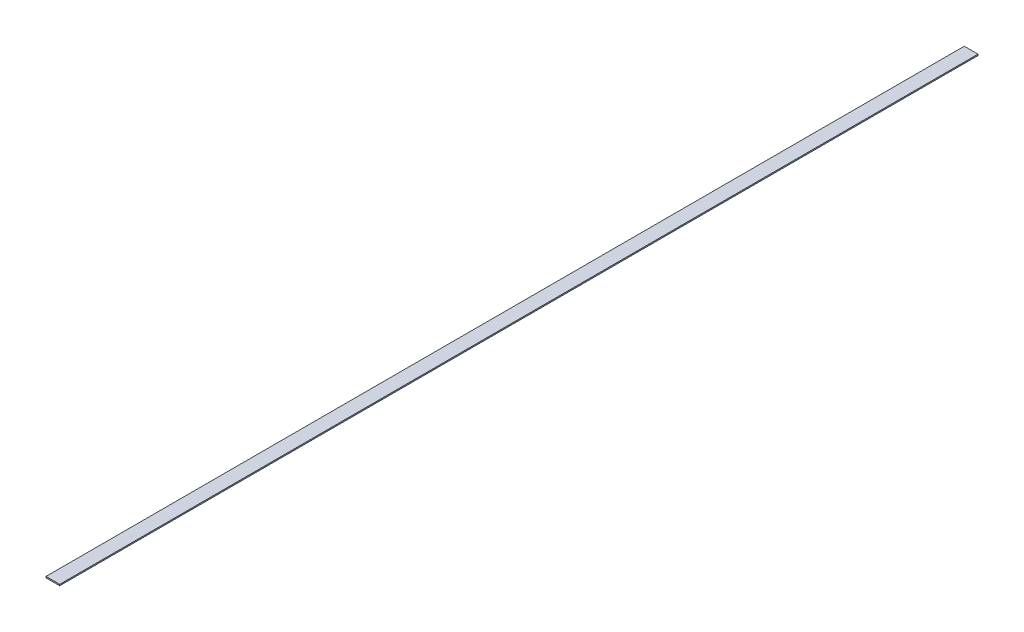
ISO-10303-21;
HEADER;
FILE_DESCRIPTION(('STEP AP214'),'2;1');
FILE_NAME('part.step','',(''),(''),'','','');
FILE_SCHEMA(('AUTOMOTIVE_DESIGN { 1 0 10303 214 1 1 1 1 }'));
ENDSEC;
DATA;
#1=APPLICATION_CONTEXT('core data for automotive mechanical design processes');
#2=APPLICATION_PROTOCOL_DEFINITION('international standard','automotive_design',2000,#1);
#3=PRODUCT_CONTEXT('',#1,'mechanical');
#4=PRODUCT('Part','Part','',(#3));
#5=PRODUCT_RELATED_PRODUCT_CATEGORY('part','',(#4));
#6=PRODUCT_DEFINITION_FORMATION('','',#4);
#7=PRODUCT_DEFINITION_CONTEXT('part definition',#1,'design');
#8=PRODUCT_DEFINITION('design','',#6,#7);
#9=PRODUCT_DEFINITION_SHAPE('','',#8);
#10=(LENGTH_UNIT() NAMED_UNIT(*) SI_UNIT(.MILLI.,.METRE.));
#11=(NAMED_UNIT(*) PLANE_ANGLE_UNIT() SI_UNIT($,.RADIAN.));
#12=(NAMED_UNIT(*) SI_UNIT($,.STERADIAN.) SOLID_ANGLE_UNIT());
#13=UNCERTAINTY_MEASURE_WITH_UNIT(LENGTH_MEASURE(1.E-05),#10,'distance_accuracy_value','');
#14=(GEOMETRIC_REPRESENTATION_CONTEXT(3) GLOBAL_UNCERTAINTY_ASSIGNED_CONTEXT((#13)) GLOBAL_UNIT_ASSIGNED_CONTEXT((#10,
#11,#12)) REPRESENTATION_CONTEXT('',''));
#15=CARTESIAN_POINT('',(0.,0.,0.));
#16=DIRECTION('',(0.,0.,1.));
#17=DIRECTION('',(1.,0.,0.));
#18=AXIS2_PLACEMENT_3D('',#15,#16,#17);
#19=CARTESIAN_POINT('',(-44.4152323486615,29.4091029218006,3403.6));
#20=DIRECTION('',(1.,0.,0.));
#21=DIRECTION('',(0.,0.,-1.));
#22=AXIS2_PLACEMENT_3D('',#19,#20,#21);
#23=PLANE('',#22);
#24=DIRECTION('',(0.,-1.,0.));
#25=VECTOR('',#24,1.);
#26=CARTESIAN_POINT('',(-44.4152323486615,29.4091029218006,0.));
#27=LINE('',#26,#25);
#28=CARTESIAN_POINT('',(-44.4152323486615,29.4091029218006,0.));
#29=VERTEX_POINT('',#28);
#30=CARTESIAN_POINT('',(-44.4152323486615,24.6466029218006,0.));
#31=VERTEX_POINT('',#30);
#32=EDGE_CURVE('E80',#29,#31,#27,.T.);
#33=ORIENTED_EDGE('',*,*,#32,.T.);
#34=DIRECTION('',(0.,0.,-1.));
#35=VECTOR('',#34,1.);
#36=CARTESIAN_POINT('',(-44.4152323486615,24.6466029218006,3403.6));
#37=LINE('',#36,#35);
#38=CARTESIAN_POINT('',(-44.4152323486615,24.6466029218006,3403.6));
#39=VERTEX_POINT('',#38);
#40=EDGE_CURVE('E11',#39,#31,#37,.T.);
#41=ORIENTED_EDGE('',*,*,#40,.F.);
#42=DIRECTION('',(0.,-1.,0.));
#43=VECTOR('',#42,1.);
#44=CARTESIAN_POINT('',(-44.4152323486615,29.4091029218006,3403.6));
#45=LINE('',#44,#43);
#46=CARTESIAN_POINT('',(-44.4152323486615,29.4091029218006,3403.6));
#47=VERTEX_POINT('',#46);
#48=EDGE_CURVE('E68',#47,#39,#45,.T.);
#49=ORIENTED_EDGE('',*,*,#48,.F.);
#50=DIRECTION('',(0.,0.,-1.));
#51=VECTOR('',#50,1.);
#52=CARTESIAN_POINT('',(-44.4152323486615,29.4091029218006,3403.6));
#53=LINE('',#52,#51);
#54=EDGE_CURVE('E76',#47,#29,#53,.T.);
#55=ORIENTED_EDGE('',*,*,#54,.T.);
#56=EDGE_LOOP('',(#33,#41,#49,#55));
#57=FACE_BOUND('',#56,.T.);
#58=ADVANCED_FACE('F17',(#57),#23,.F.);
#59=CARTESIAN_POINT('',(-44.4152323486615,24.6466029218006,3403.6));
#60=DIRECTION('',(0.,1.,0.));
#61=DIRECTION('',(0.,0.,1.));
#62=AXIS2_PLACEMENT_3D('',#59,#60,#61);
#63=PLANE('',#62);
#64=DIRECTION('',(1.,0.,0.));
#65=VECTOR('',#64,1.);
#66=CARTESIAN_POINT('',(-44.4152323486615,24.6466029218006,0.));
#67=LINE('',#66,#65);
#68=CARTESIAN_POINT('',(6.38476765133846,24.6466029218006,0.));
#69=VERTEX_POINT('',#68);
#70=EDGE_CURVE('E72',#31,#69,#67,.T.);
#71=ORIENTED_EDGE('',*,*,#70,.T.);
#72=DIRECTION('',(0.,0.,-1.));
#73=VECTOR('',#72,1.);
#74=CARTESIAN_POINT('',(6.38476765133846,24.6466029218006,3403.6));
#75=LINE('',#74,#73);
#76=CARTESIAN_POINT('',(6.38476765133846,24.6466029218006,3403.6));
#77=VERTEX_POINT('',#76);
#78=EDGE_CURVE('E25',#77,#69,#75,.T.);
#79=ORIENTED_EDGE('',*,*,#78,.F.);
#80=DIRECTION('',(1.,0.,0.));
#81=VECTOR('',#80,1.);
#82=CARTESIAN_POINT('',(-44.4152323486615,24.6466029218006,3403.6));
#83=LINE('',#82,#81);
#84=EDGE_CURVE('E63',#39,#77,#83,.T.);
#85=ORIENTED_EDGE('',*,*,#84,.F.);
#86=ORIENTED_EDGE('',*,*,#40,.T.);
#87=EDGE_LOOP('',(#71,#79,#85,#86));
#88=FACE_BOUND('',#87,.T.);
#89=ADVANCED_FACE('F71',(#88),#63,.F.);
#90=CARTESIAN_POINT('',(6.38476765133845,29.4091029218006,3403.6));
#91=DIRECTION('',(-1.,0.,0.));
#92=DIRECTION('',(0.,-1.,0.));
#93=AXIS2_PLACEMENT_3D('',#90,#91,#92);
#94=PLANE('',#93);
#95=DIRECTION('',(0.,1.,0.));
#96=VECTOR('',#95,1.);
#97=CARTESIAN_POINT('',(6.38476765133845,29.4091029218006,0.));
#98=LINE('',#97,#96);
#99=CARTESIAN_POINT('',(6.38476765133845,29.4091029218006,0.));
#100=VERTEX_POINT('',#99);
#101=EDGE_CURVE('E50',#69,#100,#98,.T.);
#102=ORIENTED_EDGE('',*,*,#101,.T.);
#103=DIRECTION('',(0.,0.,-1.));
#104=VECTOR('',#103,1.);
#105=CARTESIAN_POINT('',(6.38476765133845,29.4091029218006,3403.6));
#106=LINE('',#105,#104);
#107=CARTESIAN_POINT('',(6.38476765133845,29.4091029218006,3403.6));
#108=VERTEX_POINT('',#107);
#109=EDGE_CURVE('E73',#108,#100,#106,.T.);
#110=ORIENTED_EDGE('',*,*,#109,.F.);
#111=DIRECTION('',(0.,1.,0.));
#112=VECTOR('',#111,1.);
#113=CARTESIAN_POINT('',(6.38476765133845,29.4091029218006,3403.6));
#114=LINE('',#113,#112);
#115=EDGE_CURVE('E66',#77,#108,#114,.T.);
#116=ORIENTED_EDGE('',*,*,#115,.F.);
#117=ORIENTED_EDGE('',*,*,#78,.T.);
#118=EDGE_LOOP('',(#102,#110,#116,#117));
#119=FACE_BOUND('',#118,.T.);
#120=ADVANCED_FACE('F74',(#119),#94,.F.);
#121=CARTESIAN_POINT('',(-44.4152323486615,29.4091029218006,3403.6));
#122=DIRECTION('',(0.,-1.,0.));
#123=DIRECTION('',(0.,0.,-1.));
#124=AXIS2_PLACEMENT_3D('',#121,#122,#123);
#125=PLANE('',#124);
#126=DIRECTION('',(-1.,0.,0.));
#127=VECTOR('',#126,1.);
#128=CARTESIAN_POINT('',(-44.4152323486615,29.4091029218006,0.));
#129=LINE('',#128,#127);
#130=EDGE_CURVE('E56',#100,#29,#129,.T.);
#131=ORIENTED_EDGE('',*,*,#130,.T.);
#132=ORIENTED_EDGE('',*,*,#54,.F.);
#133=DIRECTION('',(-1.,0.,0.));
#134=VECTOR('',#133,1.);
#135=CARTESIAN_POINT('',(-44.4152323486615,29.4091029218006,3403.6));
#136=LINE('',#135,#134);
#137=EDGE_CURVE('E33',#108,#47,#136,.T.);
#138=ORIENTED_EDGE('',*,*,#137,.F.);
#139=ORIENTED_EDGE('',*,*,#109,.T.);
#140=EDGE_LOOP('',(#131,#132,#138,#139));
#141=FACE_BOUND('',#140,.T.);
#142=ADVANCED_FACE('F87',(#141),#125,.F.);
#143=CARTESIAN_POINT('',(-44.4152323486615,24.6466029218006,3403.6));
#144=DIRECTION('',(0.,0.,1.));
#145=DIRECTION('',(1.,0.,0.));
#146=AXIS2_PLACEMENT_3D('',#143,#144,#145);
#147=PLANE('',#146);
#148=ORIENTED_EDGE('',*,*,#48,.T.);
#149=ORIENTED_EDGE('',*,*,#84,.T.);
#150=ORIENTED_EDGE('',*,*,#115,.T.);
#151=ORIENTED_EDGE('',*,*,#137,.T.);
#152=EDGE_LOOP('',(#148,#149,#150,#151));
#153=FACE_BOUND('',#152,.T.);
#154=ADVANCED_FACE('F64',(#153),#147,.T.);
#155=CARTESIAN_POINT('',(-44.4152323486615,24.6466029218006,0.));
#156=DIRECTION('',(0.,0.,1.));
#157=DIRECTION('',(1.,0.,0.));
#158=AXIS2_PLACEMENT_3D('',#155,#156,#157);
#159=PLANE('',#158);
#160=ORIENTED_EDGE('',*,*,#32,.F.);
#161=ORIENTED_EDGE('',*,*,#130,.F.);
#162=ORIENTED_EDGE('',*,*,#101,.F.);
#163=ORIENTED_EDGE('',*,*,#70,.F.);
#164=EDGE_LOOP('',(#160,#161,#162,#163));
#165=FACE_BOUND('',#164,.T.);
#166=ADVANCED_FACE('F90',(#165),#159,.F.);
#167=CLOSED_SHELL('',(#58,#89,#120,#142,#154,#166));
#168=MANIFOLD_SOLID_BREP('B1',#167);
#169=ADVANCED_BREP_SHAPE_REPRESENTATION('',(#18,#168),#14);
#170=SHAPE_DEFINITION_REPRESENTATION(#9,#169);
ENDSEC;
END-ISO-10303-21;
